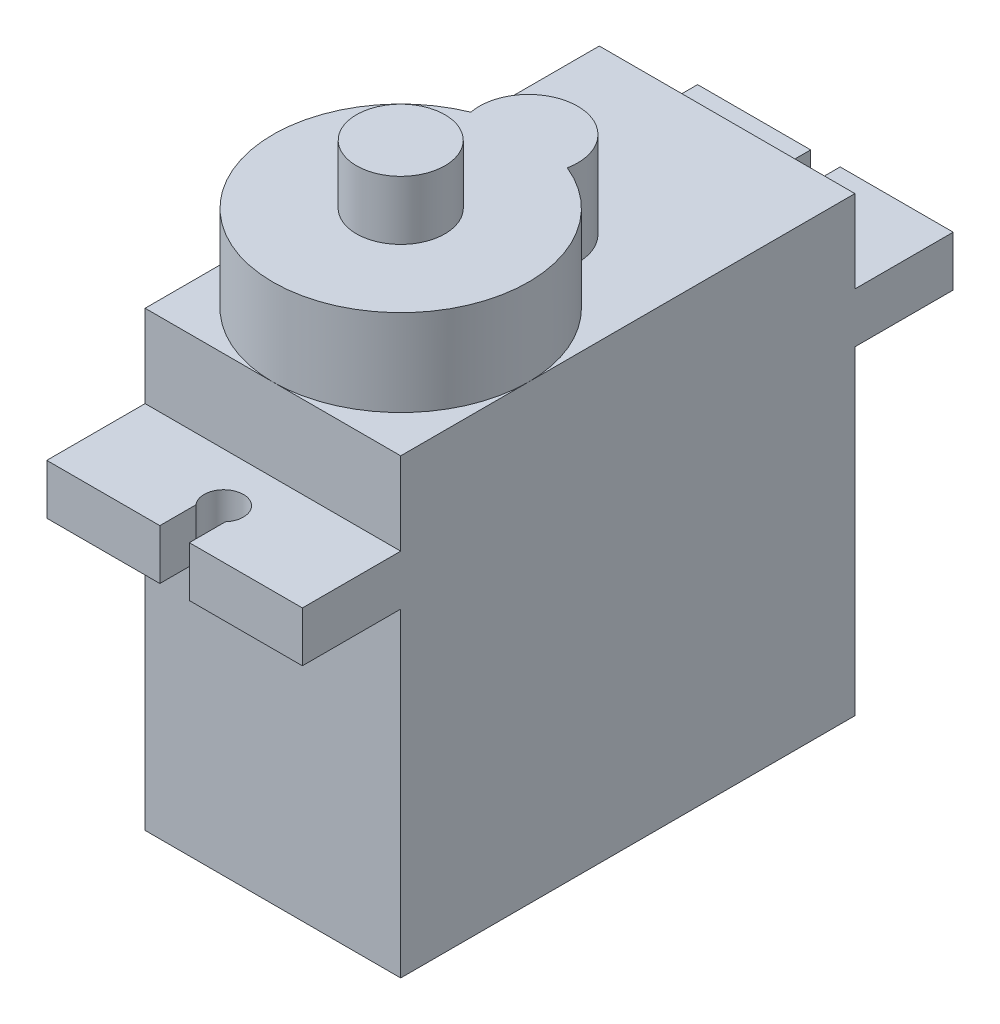
ISO-10303-21;
HEADER;
FILE_DESCRIPTION(('STEP AP214'),'2;1');
FILE_NAME('part.step','',(''),(''),'','','');
FILE_SCHEMA(('AUTOMOTIVE_DESIGN { 1 0 10303 214 1 1 1 1 }'));
ENDSEC;
DATA;
#1=APPLICATION_CONTEXT('core data for automotive mechanical design processes');
#2=APPLICATION_PROTOCOL_DEFINITION('international standard','automotive_design',2000,#1);
#3=PRODUCT_CONTEXT('',#1,'mechanical');
#4=PRODUCT('Part','Part','',(#3));
#5=PRODUCT_RELATED_PRODUCT_CATEGORY('part','',(#4));
#6=PRODUCT_DEFINITION_FORMATION('','',#4);
#7=PRODUCT_DEFINITION_CONTEXT('part definition',#1,'design');
#8=PRODUCT_DEFINITION('design','',#6,#7);
#9=PRODUCT_DEFINITION_SHAPE('','',#8);
#10=(LENGTH_UNIT() NAMED_UNIT(*) SI_UNIT(.MILLI.,.METRE.));
#11=(NAMED_UNIT(*) PLANE_ANGLE_UNIT() SI_UNIT($,.RADIAN.));
#12=(NAMED_UNIT(*) SI_UNIT($,.STERADIAN.) SOLID_ANGLE_UNIT());
#13=UNCERTAINTY_MEASURE_WITH_UNIT(LENGTH_MEASURE(1.E-05),#10,'distance_accuracy_value','');
#14=(GEOMETRIC_REPRESENTATION_CONTEXT(3) GLOBAL_UNCERTAINTY_ASSIGNED_CONTEXT((#13)) GLOBAL_UNIT_ASSIGNED_CONTEXT((#10,
#11,#12)) REPRESENTATION_CONTEXT('',''));
#15=CARTESIAN_POINT('',(0.,0.,0.));
#16=DIRECTION('',(0.,0.,1.));
#17=DIRECTION('',(1.,0.,0.));
#18=AXIS2_PLACEMENT_3D('',#15,#16,#17);
#19=CARTESIAN_POINT('',(13.,-6.75,-11.55));
#20=DIRECTION('',(0.,1.,0.));
#21=DIRECTION('',(0.,0.,1.));
#22=AXIS2_PLACEMENT_3D('',#19,#20,#21);
#23=PLANE('',#22);
#24=DIRECTION('',(0.,0.,-1.));
#25=VECTOR('',#24,1.);
#26=CARTESIAN_POINT('',(7.25,-6.75,-16.55));
#27=LINE('',#26,#25);
#28=CARTESIAN_POINT('',(7.25,-6.75,-14.7114378277662));
#29=VERTEX_POINT('',#28);
#30=CARTESIAN_POINT('',(7.25,-6.75,-16.55));
#31=VERTEX_POINT('',#30);
#32=EDGE_CURVE('E199',#29,#31,#27,.T.);
#33=ORIENTED_EDGE('',*,*,#32,.T.);
#34=DIRECTION('',(-1.,0.,0.));
#35=VECTOR('',#34,1.);
#36=CARTESIAN_POINT('',(13.,-6.75,-16.55));
#37=LINE('',#36,#35);
#38=CARTESIAN_POINT('',(13.,-6.75,-16.55));
#39=VERTEX_POINT('',#38);
#40=EDGE_CURVE('E214',#39,#31,#37,.T.);
#41=ORIENTED_EDGE('',*,*,#40,.F.);
#42=DIRECTION('',(0.,0.,-1.));
#43=VECTOR('',#42,1.);
#44=CARTESIAN_POINT('',(13.,-6.75,-11.55));
#45=LINE('',#44,#43);
#46=CARTESIAN_POINT('',(13.,-6.75,-11.55));
#47=VERTEX_POINT('',#46);
#48=EDGE_CURVE('E325',#47,#39,#45,.T.);
#49=ORIENTED_EDGE('',*,*,#48,.F.);
#50=DIRECTION('',(-1.,0.,0.));
#51=VECTOR('',#50,1.);
#52=CARTESIAN_POINT('',(13.,-6.75,-11.55));
#53=LINE('',#52,#51);
#54=CARTESIAN_POINT('',(0.,-6.75,-11.55));
#55=VERTEX_POINT('',#54);
#56=EDGE_CURVE('E222',#47,#55,#53,.T.);
#57=ORIENTED_EDGE('',*,*,#56,.T.);
#58=DIRECTION('',(0.,0.,-1.));
#59=VECTOR('',#58,1.);
#60=CARTESIAN_POINT('',(0.,-6.75,-11.55));
#61=LINE('',#60,#59);
#62=CARTESIAN_POINT('',(0.,-6.75,-16.55));
#63=VERTEX_POINT('',#62);
#64=EDGE_CURVE('E286',#55,#63,#61,.T.);
#65=ORIENTED_EDGE('',*,*,#64,.T.);
#66=CARTESIAN_POINT('',(5.75,-6.75,-16.55));
#67=VERTEX_POINT('',#66);
#68=EDGE_CURVE('E223',#67,#63,#37,.T.);
#69=ORIENTED_EDGE('',*,*,#68,.F.);
#70=DIRECTION('',(0.,0.,1.));
#71=VECTOR('',#70,1.);
#72=CARTESIAN_POINT('',(5.75,-6.75,-16.55));
#73=LINE('',#72,#71);
#74=CARTESIAN_POINT('',(5.75,-6.75,-14.7114378277662));
#75=VERTEX_POINT('',#74);
#76=EDGE_CURVE('E207',#67,#75,#73,.T.);
#77=ORIENTED_EDGE('',*,*,#76,.T.);
#78=CARTESIAN_POINT('',(6.5,-6.75,-14.05));
#79=DIRECTION('',(0.,1.,0.));
#80=DIRECTION('',(0.,0.,1.));
#81=AXIS2_PLACEMENT_3D('',#78,#79,#80);
#82=CIRCLE('',#81,1.);
#83=EDGE_CURVE('E217',#75,#29,#82,.T.);
#84=ORIENTED_EDGE('',*,*,#83,.T.);
#85=EDGE_LOOP('',(#33,#41,#49,#57,#65,#69,#77,#84));
#86=FACE_BOUND('',#85,.T.);
#87=ADVANCED_FACE('F35',(#86),#23,.F.);
#88=CARTESIAN_POINT('',(13.,-4.2,-16.55));
#89=DIRECTION('',(0.,0.,1.));
#90=DIRECTION('',(0.,-1.,0.));
#91=AXIS2_PLACEMENT_3D('',#88,#89,#90);
#92=PLANE('',#91);
#93=DIRECTION('',(0.,1.,0.));
#94=VECTOR('',#93,1.);
#95=CARTESIAN_POINT('',(7.25,-23.001,-16.55));
#96=LINE('',#95,#94);
#97=CARTESIAN_POINT('',(7.25,-4.2,-16.55));
#98=VERTEX_POINT('',#97);
#99=EDGE_CURVE('E196',#31,#98,#96,.T.);
#100=ORIENTED_EDGE('',*,*,#99,.T.);
#101=DIRECTION('',(-1.,0.,0.));
#102=VECTOR('',#101,1.);
#103=CARTESIAN_POINT('',(13.,-4.2,-16.55));
#104=LINE('',#103,#102);
#105=CARTESIAN_POINT('',(13.,-4.2,-16.55));
#106=VERTEX_POINT('',#105);
#107=EDGE_CURVE('E228',#106,#98,#104,.T.);
#108=ORIENTED_EDGE('',*,*,#107,.F.);
#109=DIRECTION('',(0.,1.,0.));
#110=VECTOR('',#109,1.);
#111=CARTESIAN_POINT('',(13.,-4.2,-16.55));
#112=LINE('',#111,#110);
#113=EDGE_CURVE('E221',#39,#106,#112,.T.);
#114=ORIENTED_EDGE('',*,*,#113,.F.);
#115=ORIENTED_EDGE('',*,*,#40,.T.);
#116=EDGE_LOOP('',(#100,#108,#114,#115));
#117=FACE_BOUND('',#116,.T.);
#118=ADVANCED_FACE('F220',(#117),#92,.F.);
#119=DIRECTION('',(0.,1.,0.));
#120=VECTOR('',#119,1.);
#121=CARTESIAN_POINT('',(5.75,-23.001,-16.55));
#122=LINE('',#121,#120);
#123=CARTESIAN_POINT('',(5.75,-4.2,-16.55));
#124=VERTEX_POINT('',#123);
#125=EDGE_CURVE('E53',#67,#124,#122,.T.);
#126=ORIENTED_EDGE('',*,*,#125,.F.);
#127=ORIENTED_EDGE('',*,*,#68,.T.);
#128=DIRECTION('',(0.,1.,0.));
#129=VECTOR('',#128,1.);
#130=CARTESIAN_POINT('',(0.,-4.2,-16.55));
#131=LINE('',#130,#129);
#132=CARTESIAN_POINT('',(0.,-4.2,-16.55));
#133=VERTEX_POINT('',#132);
#134=EDGE_CURVE('E289',#63,#133,#131,.T.);
#135=ORIENTED_EDGE('',*,*,#134,.T.);
#136=EDGE_CURVE('E309',#124,#133,#104,.T.);
#137=ORIENTED_EDGE('',*,*,#136,.F.);
#138=EDGE_LOOP('',(#126,#127,#135,#137));
#139=FACE_BOUND('',#138,.T.);
#140=ADVANCED_FACE('F368',(#139),#92,.F.);
#141=CARTESIAN_POINT('',(13.,-4.2,-11.55));
#142=DIRECTION('',(0.,-1.,0.));
#143=DIRECTION('',(0.,0.,-1.));
#144=AXIS2_PLACEMENT_3D('',#141,#142,#143);
#145=PLANE('',#144);
#146=DIRECTION('',(0.,0.,1.));
#147=VECTOR('',#146,1.);
#148=CARTESIAN_POINT('',(7.25,-4.2,-16.55));
#149=LINE('',#148,#147);
#150=CARTESIAN_POINT('',(7.25,-4.2,-14.7114378277662));
#151=VERTEX_POINT('',#150);
#152=EDGE_CURVE('E202',#98,#151,#149,.T.);
#153=ORIENTED_EDGE('',*,*,#152,.T.);
#154=CARTESIAN_POINT('',(6.5,-4.2,-14.05));
#155=DIRECTION('',(0.,-1.,0.));
#156=DIRECTION('',(0.,0.,-1.));
#157=AXIS2_PLACEMENT_3D('',#154,#155,#156);
#158=CIRCLE('',#157,1.);
#159=CARTESIAN_POINT('',(5.75,-4.2,-14.7114378277662));
#160=VERTEX_POINT('',#159);
#161=EDGE_CURVE('E660',#151,#160,#158,.T.);
#162=ORIENTED_EDGE('',*,*,#161,.T.);
#163=DIRECTION('',(0.,0.,-1.));
#164=VECTOR('',#163,1.);
#165=CARTESIAN_POINT('',(5.75,-4.2,-16.55));
#166=LINE('',#165,#164);
#167=EDGE_CURVE('E218',#160,#124,#166,.T.);
#168=ORIENTED_EDGE('',*,*,#167,.T.);
#169=ORIENTED_EDGE('',*,*,#136,.T.);
#170=DIRECTION('',(0.,0.,1.));
#171=VECTOR('',#170,1.);
#172=CARTESIAN_POINT('',(0.,-4.2,-11.55));
#173=LINE('',#172,#171);
#174=CARTESIAN_POINT('',(0.,-4.2,-11.55));
#175=VERTEX_POINT('',#174);
#176=EDGE_CURVE('E292',#133,#175,#173,.T.);
#177=ORIENTED_EDGE('',*,*,#176,.T.);
#178=DIRECTION('',(-1.,0.,0.));
#179=VECTOR('',#178,1.);
#180=CARTESIAN_POINT('',(13.,-4.2,-11.55));
#181=LINE('',#180,#179);
#182=CARTESIAN_POINT('',(13.,-4.2,-11.55));
#183=VERTEX_POINT('',#182);
#184=EDGE_CURVE('E307',#183,#175,#181,.T.);
#185=ORIENTED_EDGE('',*,*,#184,.F.);
#186=DIRECTION('',(0.,0.,1.));
#187=VECTOR('',#186,1.);
#188=CARTESIAN_POINT('',(13.,-4.2,-11.55));
#189=LINE('',#188,#187);
#190=EDGE_CURVE('E319',#106,#183,#189,.T.);
#191=ORIENTED_EDGE('',*,*,#190,.F.);
#192=ORIENTED_EDGE('',*,*,#107,.T.);
#193=EDGE_LOOP('',(#153,#162,#168,#169,#177,#185,#191,#192));
#194=FACE_BOUND('',#193,.T.);
#195=ADVANCED_FACE('F317',(#194),#145,.F.);
#196=CARTESIAN_POINT('',(13.,-4.2,16.55));
#197=DIRECTION('',(0.,0.,-1.));
#198=DIRECTION('',(0.,1.,0.));
#199=AXIS2_PLACEMENT_3D('',#196,#197,#198);
#200=PLANE('',#199);
#201=DIRECTION('',(-1.,0.,0.));
#202=VECTOR('',#201,1.);
#203=CARTESIAN_POINT('',(13.,-6.75,16.55));
#204=LINE('',#203,#202);
#205=CARTESIAN_POINT('',(5.75,-6.75,16.55));
#206=VERTEX_POINT('',#205);
#207=CARTESIAN_POINT('',(0.,-6.75,16.55));
#208=VERTEX_POINT('',#207);
#209=EDGE_CURVE('E240',#206,#208,#204,.T.);
#210=ORIENTED_EDGE('',*,*,#209,.F.);
#211=DIRECTION('',(0.,1.,0.));
#212=VECTOR('',#211,1.);
#213=CARTESIAN_POINT('',(5.75,-23.001,16.55));
#214=LINE('',#213,#212);
#215=CARTESIAN_POINT('',(5.75,-4.2,16.55));
#216=VERTEX_POINT('',#215);
#217=EDGE_CURVE('E262',#206,#216,#214,.T.);
#218=ORIENTED_EDGE('',*,*,#217,.T.);
#219=DIRECTION('',(-1.,0.,0.));
#220=VECTOR('',#219,1.);
#221=CARTESIAN_POINT('',(13.,-4.2,16.55));
#222=LINE('',#221,#220);
#223=CARTESIAN_POINT('',(0.,-4.2,16.55));
#224=VERTEX_POINT('',#223);
#225=EDGE_CURVE('E243',#216,#224,#222,.T.);
#226=ORIENTED_EDGE('',*,*,#225,.T.);
#227=DIRECTION('',(0.,-1.,0.));
#228=VECTOR('',#227,1.);
#229=CARTESIAN_POINT('',(0.,-4.2,16.55));
#230=LINE('',#229,#228);
#231=EDGE_CURVE('E260',#224,#208,#230,.T.);
#232=ORIENTED_EDGE('',*,*,#231,.T.);
#233=EDGE_LOOP('',(#210,#218,#226,#232));
#234=FACE_BOUND('',#233,.T.);
#235=ADVANCED_FACE('F258',(#234),#200,.F.);
#236=CARTESIAN_POINT('',(6.5,4.4,1.8));
#237=DIRECTION('',(0.,1.,0.));
#238=DIRECTION('',(0.,0.,1.));
#239=AXIS2_PLACEMENT_3D('',#236,#237,#238);
#240=PLANE('',#239);
#241=CARTESIAN_POINT('',(6.5,4.4,-1.45));
#242=DIRECTION('',(0.,1.,0.));
#243=DIRECTION('',(0.,0.,1.));
#244=AXIS2_PLACEMENT_3D('',#241,#242,#243);
#245=CIRCLE('',#244,2.5);
#246=CARTESIAN_POINT('',(8.95333669657174,4.4,-0.969230769230768));
#247=VERTEX_POINT('',#246);
#248=CARTESIAN_POINT('',(4.04666330342826,4.4,-0.969230769230768));
#249=VERTEX_POINT('',#248);
#250=EDGE_CURVE('E402',#247,#249,#245,.T.);
#251=ORIENTED_EDGE('',*,*,#250,.T.);
#252=CARTESIAN_POINT('',(6.5,4.4,5.05));
#253=DIRECTION('',(0.,1.,0.));
#254=DIRECTION('',(0.,0.,1.));
#255=AXIS2_PLACEMENT_3D('',#252,#253,#254);
#256=CIRCLE('',#255,6.5);
#257=EDGE_CURVE('E341',#249,#247,#256,.T.);
#258=ORIENTED_EDGE('',*,*,#257,.T.);
#259=EDGE_LOOP('',(#251,#258));
#260=FACE_BOUND('',#259,.T.);
#261=CARTESIAN_POINT('',(6.5,4.4,5.05));
#262=DIRECTION('',(0.,1.,0.));
#263=DIRECTION('',(0.,0.,1.));
#264=AXIS2_PLACEMENT_3D('',#261,#262,#263);
#265=CIRCLE('',#264,2.25);
#266=CARTESIAN_POINT('',(6.5,4.4,7.3));
#267=VERTEX_POINT('',#266);
#268=EDGE_CURVE('E395',#267,#267,#265,.T.);
#269=ORIENTED_EDGE('',*,*,#268,.F.);
#270=EDGE_LOOP('',(#269));
#271=FACE_BOUND('',#270,.T.);
#272=ADVANCED_FACE('F429',(#260,#271),#240,.T.);
#273=CARTESIAN_POINT('',(13.,0.,11.55));
#274=DIRECTION('',(0.,-1.,0.));
#275=DIRECTION('',(0.,0.,-1.));
#276=AXIS2_PLACEMENT_3D('',#273,#274,#275);
#277=PLANE('',#276);
#278=CARTESIAN_POINT('',(6.5,0.,-1.45));
#279=DIRECTION('',(0.,1.,0.));
#280=DIRECTION('',(0.,0.,1.));
#281=AXIS2_PLACEMENT_3D('',#278,#279,#280);
#282=CIRCLE('',#281,2.5);
#283=CARTESIAN_POINT('',(8.95333669657174,0.,-0.969230769230768));
#284=VERTEX_POINT('',#283);
#285=CARTESIAN_POINT('',(4.04666330342826,0.,-0.969230769230768));
#286=VERTEX_POINT('',#285);
#287=EDGE_CURVE('E399',#284,#286,#282,.T.);
#288=ORIENTED_EDGE('',*,*,#287,.F.);
#289=CARTESIAN_POINT('',(6.5,0.,5.05));
#290=DIRECTION('',(0.,1.,0.));
#291=DIRECTION('',(0.,0.,1.));
#292=AXIS2_PLACEMENT_3D('',#289,#290,#291);
#293=CIRCLE('',#292,6.5);
#294=CARTESIAN_POINT('',(13.,0.,5.05));
#295=VERTEX_POINT('',#294);
#296=EDGE_CURVE('E251',#295,#284,#293,.T.);
#297=ORIENTED_EDGE('',*,*,#296,.F.);
#298=DIRECTION('',(0.,0.,1.));
#299=VECTOR('',#298,1.);
#300=CARTESIAN_POINT('',(13.,0.,11.55));
#301=LINE('',#300,#299);
#302=CARTESIAN_POINT('',(13.,0.,-11.55));
#303=VERTEX_POINT('',#302);
#304=EDGE_CURVE('E329',#303,#295,#301,.T.);
#305=ORIENTED_EDGE('',*,*,#304,.F.);
#306=DIRECTION('',(-1.,0.,0.));
#307=VECTOR('',#306,1.);
#308=CARTESIAN_POINT('',(13.,0.,-11.55));
#309=LINE('',#308,#307);
#310=CARTESIAN_POINT('',(0.,0.,-11.55));
#311=VERTEX_POINT('',#310);
#312=EDGE_CURVE('E304',#303,#311,#309,.T.);
#313=ORIENTED_EDGE('',*,*,#312,.T.);
#314=DIRECTION('',(0.,0.,1.));
#315=VECTOR('',#314,1.);
#316=CARTESIAN_POINT('',(0.,0.,11.55));
#317=LINE('',#316,#315);
#318=CARTESIAN_POINT('',(0.,0.,5.05));
#319=VERTEX_POINT('',#318);
#320=EDGE_CURVE('E297',#311,#319,#317,.T.);
#321=ORIENTED_EDGE('',*,*,#320,.T.);
#322=EDGE_CURVE('E46',#286,#319,#293,.T.);
#323=ORIENTED_EDGE('',*,*,#322,.F.);
#324=EDGE_LOOP('',(#288,#297,#305,#313,#321,#323));
#325=FACE_BOUND('',#324,.T.);
#326=ADVANCED_FACE('F423',(#325),#277,.F.);
#327=CARTESIAN_POINT('',(6.5,0.,11.55));
#328=VERTEX_POINT('',#327);
#329=EDGE_CURVE('E11',#319,#328,#293,.T.);
#330=ORIENTED_EDGE('',*,*,#329,.F.);
#331=CARTESIAN_POINT('',(0.,0.,11.55));
#332=VERTEX_POINT('',#331);
#333=EDGE_CURVE('E296',#319,#332,#317,.T.);
#334=ORIENTED_EDGE('',*,*,#333,.T.);
#335=DIRECTION('',(-1.,0.,0.));
#336=VECTOR('',#335,1.);
#337=CARTESIAN_POINT('',(13.,0.,11.55));
#338=LINE('',#337,#336);
#339=EDGE_CURVE('E305',#328,#332,#338,.T.);
#340=ORIENTED_EDGE('',*,*,#339,.F.);
#341=EDGE_LOOP('',(#330,#334,#340));
#342=FACE_BOUND('',#341,.T.);
#343=ADVANCED_FACE('F418',(#342),#277,.F.);
#344=EDGE_CURVE('E44',#328,#295,#293,.T.);
#345=ORIENTED_EDGE('',*,*,#344,.F.);
#346=CARTESIAN_POINT('',(13.,0.,11.55));
#347=VERTEX_POINT('',#346);
#348=EDGE_CURVE('E301',#347,#328,#338,.T.);
#349=ORIENTED_EDGE('',*,*,#348,.F.);
#350=EDGE_CURVE('E323',#295,#347,#301,.T.);
#351=ORIENTED_EDGE('',*,*,#350,.F.);
#352=EDGE_LOOP('',(#345,#349,#351));
#353=FACE_BOUND('',#352,.T.);
#354=ADVANCED_FACE('F414',(#353),#277,.F.);
#355=CARTESIAN_POINT('',(13.,0.,11.55));
#356=DIRECTION('',(0.,0.,-1.));
#357=DIRECTION('',(-1.,0.,0.));
#358=AXIS2_PLACEMENT_3D('',#355,#356,#357);
#359=PLANE('',#358);
#360=DIRECTION('',(0.,-1.,0.));
#361=VECTOR('',#360,1.);
#362=CARTESIAN_POINT('',(0.,0.,11.55));
#363=LINE('',#362,#361);
#364=CARTESIAN_POINT('',(0.,-4.2,11.55));
#365=VERTEX_POINT('',#364);
#366=EDGE_CURVE('E271',#332,#365,#363,.T.);
#367=ORIENTED_EDGE('',*,*,#366,.T.);
#368=DIRECTION('',(-1.,0.,0.));
#369=VECTOR('',#368,1.);
#370=CARTESIAN_POINT('',(13.,-4.2,11.55));
#371=LINE('',#370,#369);
#372=CARTESIAN_POINT('',(13.,-4.2,11.55));
#373=VERTEX_POINT('',#372);
#374=EDGE_CURVE('E39',#373,#365,#371,.T.);
#375=ORIENTED_EDGE('',*,*,#374,.F.);
#376=DIRECTION('',(0.,-1.,0.));
#377=VECTOR('',#376,1.);
#378=CARTESIAN_POINT('',(13.,0.,11.55));
#379=LINE('',#378,#377);
#380=EDGE_CURVE('E300',#347,#373,#379,.T.);
#381=ORIENTED_EDGE('',*,*,#380,.F.);
#382=ORIENTED_EDGE('',*,*,#348,.T.);
#383=ORIENTED_EDGE('',*,*,#339,.T.);
#384=EDGE_LOOP('',(#367,#375,#381,#382,#383));
#385=FACE_BOUND('',#384,.T.);
#386=ADVANCED_FACE('F37',(#385),#359,.F.);
#387=CARTESIAN_POINT('',(13.,-4.2,16.55));
#388=DIRECTION('',(0.,-1.,0.));
#389=DIRECTION('',(0.,0.,-1.));
#390=AXIS2_PLACEMENT_3D('',#387,#388,#389);
#391=PLANE('',#390);
#392=ORIENTED_EDGE('',*,*,#225,.F.);
#393=DIRECTION('',(0.,0.,1.));
#394=VECTOR('',#393,1.);
#395=CARTESIAN_POINT('',(5.75,-4.2,16.55));
#396=LINE('',#395,#394);
#397=CARTESIAN_POINT('',(5.75,-4.2,14.7114378277662));
#398=VERTEX_POINT('',#397);
#399=EDGE_CURVE('E384',#398,#216,#396,.T.);
#400=ORIENTED_EDGE('',*,*,#399,.F.);
#401=CARTESIAN_POINT('',(6.5,-4.2,14.05));
#402=DIRECTION('',(0.,1.,0.));
#403=DIRECTION('',(0.,0.,1.));
#404=AXIS2_PLACEMENT_3D('',#401,#402,#403);
#405=CIRCLE('',#404,1.);
#406=CARTESIAN_POINT('',(7.25,-4.2,14.7114378277662));
#407=VERTEX_POINT('',#406);
#408=EDGE_CURVE('E381',#407,#398,#405,.T.);
#409=ORIENTED_EDGE('',*,*,#408,.F.);
#410=DIRECTION('',(0.,0.,-1.));
#411=VECTOR('',#410,1.);
#412=CARTESIAN_POINT('',(7.25,-4.2,16.55));
#413=LINE('',#412,#411);
#414=CARTESIAN_POINT('',(7.25,-4.2,16.55));
#415=VERTEX_POINT('',#414);
#416=EDGE_CURVE('E378',#415,#407,#413,.T.);
#417=ORIENTED_EDGE('',*,*,#416,.F.);
#418=CARTESIAN_POINT('',(13.,-4.2,16.55));
#419=VERTEX_POINT('',#418);
#420=EDGE_CURVE('E244',#419,#415,#222,.T.);
#421=ORIENTED_EDGE('',*,*,#420,.F.);
#422=DIRECTION('',(0.,0.,1.));
#423=VECTOR('',#422,1.);
#424=CARTESIAN_POINT('',(13.,-4.2,16.55));
#425=LINE('',#424,#423);
#426=EDGE_CURVE('E346',#373,#419,#425,.T.);
#427=ORIENTED_EDGE('',*,*,#426,.F.);
#428=ORIENTED_EDGE('',*,*,#374,.T.);
#429=DIRECTION('',(0.,0.,1.));
#430=VECTOR('',#429,1.);
#431=CARTESIAN_POINT('',(0.,-4.2,16.55));
#432=LINE('',#431,#430);
#433=EDGE_CURVE('E265',#365,#224,#432,.T.);
#434=ORIENTED_EDGE('',*,*,#433,.T.);
#435=EDGE_LOOP('',(#392,#400,#409,#417,#421,#427,#428,#434));
#436=FACE_BOUND('',#435,.T.);
#437=ADVANCED_FACE('F266',(#436),#391,.F.);
#438=ORIENTED_EDGE('',*,*,#420,.T.);
#439=DIRECTION('',(0.,1.,0.));
#440=VECTOR('',#439,1.);
#441=CARTESIAN_POINT('',(7.25,-23.001,16.55));
#442=LINE('',#441,#440);
#443=CARTESIAN_POINT('',(7.25,-6.75,16.55));
#444=VERTEX_POINT('',#443);
#445=EDGE_CURVE('E386',#444,#415,#442,.T.);
#446=ORIENTED_EDGE('',*,*,#445,.F.);
#447=CARTESIAN_POINT('',(13.,-6.75,16.55));
#448=VERTEX_POINT('',#447);
#449=EDGE_CURVE('E241',#448,#444,#204,.T.);
#450=ORIENTED_EDGE('',*,*,#449,.F.);
#451=DIRECTION('',(0.,-1.,0.));
#452=VECTOR('',#451,1.);
#453=CARTESIAN_POINT('',(13.,-4.2,16.55));
#454=LINE('',#453,#452);
#455=EDGE_CURVE('E348',#419,#448,#454,.T.);
#456=ORIENTED_EDGE('',*,*,#455,.F.);
#457=EDGE_LOOP('',(#438,#446,#450,#456));
#458=FACE_BOUND('',#457,.T.);
#459=ADVANCED_FACE('F472',(#458),#200,.F.);
#460=CARTESIAN_POINT('',(13.,-6.75,16.55));
#461=DIRECTION('',(0.,1.,0.));
#462=DIRECTION('',(0.,0.,1.));
#463=AXIS2_PLACEMENT_3D('',#460,#461,#462);
#464=PLANE('',#463);
#465=CARTESIAN_POINT('',(6.5,-6.75,14.05));
#466=DIRECTION('',(0.,1.,0.));
#467=DIRECTION('',(0.,0.,1.));
#468=AXIS2_PLACEMENT_3D('',#465,#466,#467);
#469=CIRCLE('',#468,1.);
#470=CARTESIAN_POINT('',(5.75,-6.75,14.7114378277662));
#471=VERTEX_POINT('',#470);
#472=CARTESIAN_POINT('',(7.25,-6.75,14.7114378277662));
#473=VERTEX_POINT('',#472);
#474=EDGE_CURVE('E61',#471,#473,#469,.F.);
#475=ORIENTED_EDGE('',*,*,#474,.F.);
#476=DIRECTION('',(0.,0.,-1.));
#477=VECTOR('',#476,1.);
#478=CARTESIAN_POINT('',(5.75,-6.75,16.55));
#479=LINE('',#478,#477);
#480=EDGE_CURVE('E371',#206,#471,#479,.T.);
#481=ORIENTED_EDGE('',*,*,#480,.F.);
#482=ORIENTED_EDGE('',*,*,#209,.T.);
#483=DIRECTION('',(0.,0.,-1.));
#484=VECTOR('',#483,1.);
#485=CARTESIAN_POINT('',(0.,-6.75,16.55));
#486=LINE('',#485,#484);
#487=CARTESIAN_POINT('',(0.,-6.75,11.55));
#488=VERTEX_POINT('',#487);
#489=EDGE_CURVE('E275',#208,#488,#486,.T.);
#490=ORIENTED_EDGE('',*,*,#489,.T.);
#491=DIRECTION('',(-1.,0.,0.));
#492=VECTOR('',#491,1.);
#493=CARTESIAN_POINT('',(13.,-6.75,11.55));
#494=LINE('',#493,#492);
#495=CARTESIAN_POINT('',(13.,-6.75,11.55));
#496=VERTEX_POINT('',#495);
#497=EDGE_CURVE('E237',#496,#488,#494,.T.);
#498=ORIENTED_EDGE('',*,*,#497,.F.);
#499=DIRECTION('',(0.,0.,-1.));
#500=VECTOR('',#499,1.);
#501=CARTESIAN_POINT('',(13.,-6.75,16.55));
#502=LINE('',#501,#500);
#503=EDGE_CURVE('E350',#448,#496,#502,.T.);
#504=ORIENTED_EDGE('',*,*,#503,.F.);
#505=ORIENTED_EDGE('',*,*,#449,.T.);
#506=DIRECTION('',(0.,0.,1.));
#507=VECTOR('',#506,1.);
#508=CARTESIAN_POINT('',(7.25,-6.75,16.55));
#509=LINE('',#508,#507);
#510=EDGE_CURVE('E388',#473,#444,#509,.T.);
#511=ORIENTED_EDGE('',*,*,#510,.F.);
#512=EDGE_LOOP('',(#475,#481,#482,#490,#498,#504,#505,#511));
#513=FACE_BOUND('',#512,.T.);
#514=ADVANCED_FACE('F468',(#513),#464,.F.);
#515=CARTESIAN_POINT('',(13.,-6.75,11.55));
#516=DIRECTION('',(0.,0.,-1.));
#517=DIRECTION('',(0.,1.,0.));
#518=AXIS2_PLACEMENT_3D('',#515,#516,#517);
#519=PLANE('',#518);
#520=DIRECTION('',(0.,-1.,0.));
#521=VECTOR('',#520,1.);
#522=CARTESIAN_POINT('',(0.,-6.75,11.55));
#523=LINE('',#522,#521);
#524=CARTESIAN_POINT('',(0.,-23.,11.55));
#525=VERTEX_POINT('',#524);
#526=EDGE_CURVE('E277',#488,#525,#523,.T.);
#527=ORIENTED_EDGE('',*,*,#526,.T.);
#528=DIRECTION('',(-1.,0.,0.));
#529=VECTOR('',#528,1.);
#530=CARTESIAN_POINT('',(13.,-23.,11.55));
#531=LINE('',#530,#529);
#532=CARTESIAN_POINT('',(13.,-23.,11.55));
#533=VERTEX_POINT('',#532);
#534=EDGE_CURVE('E234',#533,#525,#531,.T.);
#535=ORIENTED_EDGE('',*,*,#534,.F.);
#536=DIRECTION('',(0.,-1.,0.));
#537=VECTOR('',#536,1.);
#538=CARTESIAN_POINT('',(13.,-6.75,11.55));
#539=LINE('',#538,#537);
#540=EDGE_CURVE('E352',#496,#533,#539,.T.);
#541=ORIENTED_EDGE('',*,*,#540,.F.);
#542=ORIENTED_EDGE('',*,*,#497,.T.);
#543=EDGE_LOOP('',(#527,#535,#541,#542));
#544=FACE_BOUND('',#543,.T.);
#545=ADVANCED_FACE('F464',(#544),#519,.F.);
#546=CARTESIAN_POINT('',(13.,-23.,11.55));
#547=DIRECTION('',(0.,1.,0.));
#548=DIRECTION('',(0.,0.,1.));
#549=AXIS2_PLACEMENT_3D('',#546,#547,#548);
#550=PLANE('',#549);
#551=DIRECTION('',(0.,0.,-1.));
#552=VECTOR('',#551,1.);
#553=CARTESIAN_POINT('',(0.,-23.,11.55));
#554=LINE('',#553,#552);
#555=CARTESIAN_POINT('',(0.,-23.,-11.55));
#556=VERTEX_POINT('',#555);
#557=EDGE_CURVE('E282',#525,#556,#554,.T.);
#558=ORIENTED_EDGE('',*,*,#557,.T.);
#559=DIRECTION('',(-1.,0.,0.));
#560=VECTOR('',#559,1.);
#561=CARTESIAN_POINT('',(13.,-23.,-11.55));
#562=LINE('',#561,#560);
#563=CARTESIAN_POINT('',(13.,-23.,-11.55));
#564=VERTEX_POINT('',#563);
#565=EDGE_CURVE('E226',#564,#556,#562,.T.);
#566=ORIENTED_EDGE('',*,*,#565,.F.);
#567=DIRECTION('',(0.,0.,-1.));
#568=VECTOR('',#567,1.);
#569=CARTESIAN_POINT('',(13.,-23.,11.55));
#570=LINE('',#569,#568);
#571=EDGE_CURVE('E354',#533,#564,#570,.T.);
#572=ORIENTED_EDGE('',*,*,#571,.F.);
#573=ORIENTED_EDGE('',*,*,#534,.T.);
#574=EDGE_LOOP('',(#558,#566,#572,#573));
#575=FACE_BOUND('',#574,.T.);
#576=ADVANCED_FACE('F461',(#575),#550,.F.);
#577=CARTESIAN_POINT('',(13.,-6.75,-11.55));
#578=DIRECTION('',(0.,0.,1.));
#579=DIRECTION('',(0.,-1.,0.));
#580=AXIS2_PLACEMENT_3D('',#577,#578,#579);
#581=PLANE('',#580);
#582=DIRECTION('',(0.,1.,0.));
#583=VECTOR('',#582,1.);
#584=CARTESIAN_POINT('',(0.,-6.75,-11.55));
#585=LINE('',#584,#583);
#586=EDGE_CURVE('E284',#556,#55,#585,.T.);
#587=ORIENTED_EDGE('',*,*,#586,.T.);
#588=ORIENTED_EDGE('',*,*,#56,.F.);
#589=DIRECTION('',(0.,1.,0.));
#590=VECTOR('',#589,1.);
#591=CARTESIAN_POINT('',(13.,-6.75,-11.55));
#592=LINE('',#591,#590);
#593=EDGE_CURVE('E356',#564,#47,#592,.T.);
#594=ORIENTED_EDGE('',*,*,#593,.F.);
#595=ORIENTED_EDGE('',*,*,#565,.T.);
#596=EDGE_LOOP('',(#587,#588,#594,#595));
#597=FACE_BOUND('',#596,.T.);
#598=ADVANCED_FACE('F457',(#597),#581,.F.);
#599=CARTESIAN_POINT('',(13.,0.,-11.55));
#600=DIRECTION('',(0.,0.,1.));
#601=DIRECTION('',(1.,0.,0.));
#602=AXIS2_PLACEMENT_3D('',#599,#600,#601);
#603=PLANE('',#602);
#604=DIRECTION('',(0.,1.,0.));
#605=VECTOR('',#604,1.);
#606=CARTESIAN_POINT('',(0.,0.,-11.55));
#607=LINE('',#606,#605);
#608=EDGE_CURVE('E294',#175,#311,#607,.T.);
#609=ORIENTED_EDGE('',*,*,#608,.T.);
#610=ORIENTED_EDGE('',*,*,#312,.F.);
#611=DIRECTION('',(0.,1.,0.));
#612=VECTOR('',#611,1.);
#613=CARTESIAN_POINT('',(13.,0.,-11.55));
#614=LINE('',#613,#612);
#615=EDGE_CURVE('E321',#183,#303,#614,.T.);
#616=ORIENTED_EDGE('',*,*,#615,.F.);
#617=ORIENTED_EDGE('',*,*,#184,.T.);
#618=EDGE_LOOP('',(#609,#610,#616,#617));
#619=FACE_BOUND('',#618,.T.);
#620=ADVANCED_FACE('F460',(#619),#603,.F.);
#621=CARTESIAN_POINT('',(13.,0.,0.));
#622=DIRECTION('',(1.,0.,0.));
#623=DIRECTION('',(0.,0.,-1.));
#624=AXIS2_PLACEMENT_3D('',#621,#622,#623);
#625=PLANE('',#624);
#626=ORIENTED_EDGE('',*,*,#380,.T.);
#627=ORIENTED_EDGE('',*,*,#426,.T.);
#628=ORIENTED_EDGE('',*,*,#455,.T.);
#629=ORIENTED_EDGE('',*,*,#503,.T.);
#630=ORIENTED_EDGE('',*,*,#540,.T.);
#631=ORIENTED_EDGE('',*,*,#571,.T.);
#632=ORIENTED_EDGE('',*,*,#593,.T.);
#633=ORIENTED_EDGE('',*,*,#48,.T.);
#634=ORIENTED_EDGE('',*,*,#113,.T.);
#635=ORIENTED_EDGE('',*,*,#190,.T.);
#636=ORIENTED_EDGE('',*,*,#615,.T.);
#637=ORIENTED_EDGE('',*,*,#304,.T.);
#638=ORIENTED_EDGE('',*,*,#350,.T.);
#639=EDGE_LOOP('',(#626,#627,#628,#629,#630,#631,#632,#633,#634,#635,#636,#637,#638));
#640=FACE_BOUND('',#639,.T.);
#641=ADVANCED_FACE('F357',(#640),#625,.T.);
#642=CARTESIAN_POINT('',(0.,0.,0.));
#643=DIRECTION('',(1.,0.,0.));
#644=DIRECTION('',(0.,0.,-1.));
#645=AXIS2_PLACEMENT_3D('',#642,#643,#644);
#646=PLANE('',#645);
#647=ORIENTED_EDGE('',*,*,#366,.F.);
#648=ORIENTED_EDGE('',*,*,#333,.F.);
#649=ORIENTED_EDGE('',*,*,#320,.F.);
#650=ORIENTED_EDGE('',*,*,#608,.F.);
#651=ORIENTED_EDGE('',*,*,#176,.F.);
#652=ORIENTED_EDGE('',*,*,#134,.F.);
#653=ORIENTED_EDGE('',*,*,#64,.F.);
#654=ORIENTED_EDGE('',*,*,#586,.F.);
#655=ORIENTED_EDGE('',*,*,#557,.F.);
#656=ORIENTED_EDGE('',*,*,#526,.F.);
#657=ORIENTED_EDGE('',*,*,#489,.F.);
#658=ORIENTED_EDGE('',*,*,#231,.F.);
#659=ORIENTED_EDGE('',*,*,#433,.F.);
#660=EDGE_LOOP('',(#647,#648,#649,#650,#651,#652,#653,#654,#655,#656,#657,#658,#659));
#661=FACE_BOUND('',#660,.T.);
#662=ADVANCED_FACE('F273',(#661),#646,.F.);
#663=CARTESIAN_POINT('',(6.5,4.4,-1.45));
#664=DIRECTION('',(0.,-1.,0.));
#665=DIRECTION('',(0.,0.,-1.));
#666=AXIS2_PLACEMENT_3D('',#663,#664,#665);
#667=CYLINDRICAL_SURFACE('',#666,2.5);
#668=ORIENTED_EDGE('',*,*,#287,.T.);
#669=DIRECTION('',(0.,-1.,0.));
#670=VECTOR('',#669,1.);
#671=CARTESIAN_POINT('',(4.04666330342826,4.4,-0.969230769230768));
#672=LINE('',#671,#670);
#673=EDGE_CURVE('E331',#249,#286,#672,.T.);
#674=ORIENTED_EDGE('',*,*,#673,.F.);
#675=ORIENTED_EDGE('',*,*,#250,.F.);
#676=DIRECTION('',(0.,-1.,0.));
#677=VECTOR('',#676,1.);
#678=CARTESIAN_POINT('',(8.95333669657174,4.4,-0.969230769230768));
#679=LINE('',#678,#677);
#680=EDGE_CURVE('E334',#247,#284,#679,.T.);
#681=ORIENTED_EDGE('',*,*,#680,.T.);
#682=EDGE_LOOP('',(#668,#674,#675,#681));
#683=FACE_BOUND('',#682,.T.);
#684=ADVANCED_FACE('F426',(#683),#667,.T.);
#685=CARTESIAN_POINT('',(6.5,4.4,5.05));
#686=DIRECTION('',(0.,-1.,0.));
#687=DIRECTION('',(0.,0.,-1.));
#688=AXIS2_PLACEMENT_3D('',#685,#686,#687);
#689=CYLINDRICAL_SURFACE('',#688,6.5);
#690=ORIENTED_EDGE('',*,*,#322,.T.);
#691=ORIENTED_EDGE('',*,*,#329,.T.);
#692=ORIENTED_EDGE('',*,*,#344,.T.);
#693=ORIENTED_EDGE('',*,*,#296,.T.);
#694=ORIENTED_EDGE('',*,*,#680,.F.);
#695=ORIENTED_EDGE('',*,*,#257,.F.);
#696=ORIENTED_EDGE('',*,*,#673,.T.);
#697=EDGE_LOOP('',(#690,#691,#692,#693,#694,#695,#696));
#698=FACE_BOUND('',#697,.T.);
#699=ADVANCED_FACE('F409',(#698),#689,.T.);
#700=CARTESIAN_POINT('',(6.5,7.4,5.05));
#701=DIRECTION('',(0.,-1.,0.));
#702=DIRECTION('',(0.,0.,-1.));
#703=AXIS2_PLACEMENT_3D('',#700,#701,#702);
#704=CYLINDRICAL_SURFACE('',#703,2.25);
#705=CARTESIAN_POINT('',(6.5,7.4,5.05));
#706=DIRECTION('',(0.,1.,0.));
#707=DIRECTION('',(0.,0.,1.));
#708=AXIS2_PLACEMENT_3D('',#705,#706,#707);
#709=CIRCLE('',#708,2.25);
#710=CARTESIAN_POINT('',(6.5,7.4,7.3));
#711=VERTEX_POINT('',#710);
#712=EDGE_CURVE('E396',#711,#711,#709,.T.);
#713=ORIENTED_EDGE('',*,*,#712,.F.);
#714=EDGE_LOOP('',(#713));
#715=FACE_BOUND('',#714,.T.);
#716=ORIENTED_EDGE('',*,*,#268,.T.);
#717=EDGE_LOOP('',(#716));
#718=FACE_BOUND('',#717,.T.);
#719=ADVANCED_FACE('F435',(#715,#718),#704,.T.);
#720=CARTESIAN_POINT('',(6.5,7.4,5.05));
#721=DIRECTION('',(0.,1.,0.));
#722=DIRECTION('',(0.,0.,1.));
#723=AXIS2_PLACEMENT_3D('',#720,#721,#722);
#724=PLANE('',#723);
#725=ORIENTED_EDGE('',*,*,#712,.T.);
#726=EDGE_LOOP('',(#725));
#727=FACE_BOUND('',#726,.T.);
#728=ADVANCED_FACE('F437',(#727),#724,.T.);
#729=CARTESIAN_POINT('',(5.75,-23.001,16.55));
#730=DIRECTION('',(-1.,0.,0.));
#731=DIRECTION('',(0.,0.,1.));
#732=AXIS2_PLACEMENT_3D('',#729,#730,#731);
#733=PLANE('',#732);
#734=ORIENTED_EDGE('',*,*,#480,.T.);
#735=DIRECTION('',(0.,1.,0.));
#736=VECTOR('',#735,1.);
#737=CARTESIAN_POINT('',(5.75,-23.001,14.7114378277662));
#738=LINE('',#737,#736);
#739=EDGE_CURVE('E389',#471,#398,#738,.T.);
#740=ORIENTED_EDGE('',*,*,#739,.T.);
#741=ORIENTED_EDGE('',*,*,#399,.T.);
#742=ORIENTED_EDGE('',*,*,#217,.F.);
#743=EDGE_LOOP('',(#734,#740,#741,#742));
#744=FACE_BOUND('',#743,.T.);
#745=ADVANCED_FACE('F444',(#744),#733,.F.);
#746=CARTESIAN_POINT('',(6.5,-23.001,14.05));
#747=DIRECTION('',(0.,1.,0.));
#748=DIRECTION('',(0.,0.,1.));
#749=AXIS2_PLACEMENT_3D('',#746,#747,#748);
#750=CYLINDRICAL_SURFACE('',#749,1.);
#751=ORIENTED_EDGE('',*,*,#474,.T.);
#752=DIRECTION('',(0.,1.,0.));
#753=VECTOR('',#752,1.);
#754=CARTESIAN_POINT('',(7.25,-23.001,14.7114378277662));
#755=LINE('',#754,#753);
#756=EDGE_CURVE('E391',#473,#407,#755,.T.);
#757=ORIENTED_EDGE('',*,*,#756,.T.);
#758=ORIENTED_EDGE('',*,*,#408,.T.);
#759=ORIENTED_EDGE('',*,*,#739,.F.);
#760=EDGE_LOOP('',(#751,#757,#758,#759));
#761=FACE_BOUND('',#760,.T.);
#762=ADVANCED_FACE('F585',(#761),#750,.F.);
#763=CARTESIAN_POINT('',(7.25,-23.001,16.55));
#764=DIRECTION('',(1.,0.,0.));
#765=DIRECTION('',(0.,0.,-1.));
#766=AXIS2_PLACEMENT_3D('',#763,#764,#765);
#767=PLANE('',#766);
#768=ORIENTED_EDGE('',*,*,#510,.T.);
#769=ORIENTED_EDGE('',*,*,#445,.T.);
#770=ORIENTED_EDGE('',*,*,#416,.T.);
#771=ORIENTED_EDGE('',*,*,#756,.F.);
#772=EDGE_LOOP('',(#768,#769,#770,#771));
#773=FACE_BOUND('',#772,.T.);
#774=ADVANCED_FACE('F595',(#773),#767,.F.);
#775=CARTESIAN_POINT('',(7.25,-23.001,-16.55));
#776=DIRECTION('',(-1.,0.,0.));
#777=DIRECTION('',(0.,0.,1.));
#778=AXIS2_PLACEMENT_3D('',#775,#776,#777);
#779=PLANE('',#778);
#780=DIRECTION('',(0.,1.,0.));
#781=VECTOR('',#780,1.);
#782=CARTESIAN_POINT('',(7.25,-23.001,-14.7114378277662));
#783=LINE('',#782,#781);
#784=EDGE_CURVE('E208',#29,#151,#783,.T.);
#785=ORIENTED_EDGE('',*,*,#784,.T.);
#786=ORIENTED_EDGE('',*,*,#152,.F.);
#787=ORIENTED_EDGE('',*,*,#99,.F.);
#788=ORIENTED_EDGE('',*,*,#32,.F.);
#789=EDGE_LOOP('',(#785,#786,#787,#788));
#790=FACE_BOUND('',#789,.T.);
#791=ADVANCED_FACE('F198',(#790),#779,.T.);
#792=CARTESIAN_POINT('',(6.5,-23.001,-14.05));
#793=DIRECTION('',(0.,1.,0.));
#794=DIRECTION('',(0.,0.,1.));
#795=AXIS2_PLACEMENT_3D('',#792,#793,#794);
#796=CYLINDRICAL_SURFACE('',#795,1.);
#797=DIRECTION('',(0.,1.,0.));
#798=VECTOR('',#797,1.);
#799=CARTESIAN_POINT('',(5.75,-23.001,-14.7114378277662));
#800=LINE('',#799,#798);
#801=EDGE_CURVE('E659',#75,#160,#800,.T.);
#802=ORIENTED_EDGE('',*,*,#801,.T.);
#803=ORIENTED_EDGE('',*,*,#161,.F.);
#804=ORIENTED_EDGE('',*,*,#784,.F.);
#805=ORIENTED_EDGE('',*,*,#83,.F.);
#806=EDGE_LOOP('',(#802,#803,#804,#805));
#807=FACE_BOUND('',#806,.T.);
#808=ADVANCED_FACE('F636',(#807),#796,.F.);
#809=CARTESIAN_POINT('',(5.75,-23.001,-16.55));
#810=DIRECTION('',(1.,0.,0.));
#811=DIRECTION('',(0.,0.,-1.));
#812=AXIS2_PLACEMENT_3D('',#809,#810,#811);
#813=PLANE('',#812);
#814=ORIENTED_EDGE('',*,*,#125,.T.);
#815=ORIENTED_EDGE('',*,*,#167,.F.);
#816=ORIENTED_EDGE('',*,*,#801,.F.);
#817=ORIENTED_EDGE('',*,*,#76,.F.);
#818=EDGE_LOOP('',(#814,#815,#816,#817));
#819=FACE_BOUND('',#818,.T.);
#820=ADVANCED_FACE('F645',(#819),#813,.T.);
#821=CLOSED_SHELL('',(#87,#118,#140,#195,#235,#272,#326,#343,#354,#386,#437,#459,#514,#545,#576,
#598,#620,#641,#662,#684,#699,#719,#728,#745,#762,#774,#791,#808,#820));
#822=MANIFOLD_SOLID_BREP('B2',#821);
#823=ADVANCED_BREP_SHAPE_REPRESENTATION('',(#18,#822),#14);
#824=SHAPE_DEFINITION_REPRESENTATION(#9,#823);
ENDSEC;
END-ISO-10303-21;
